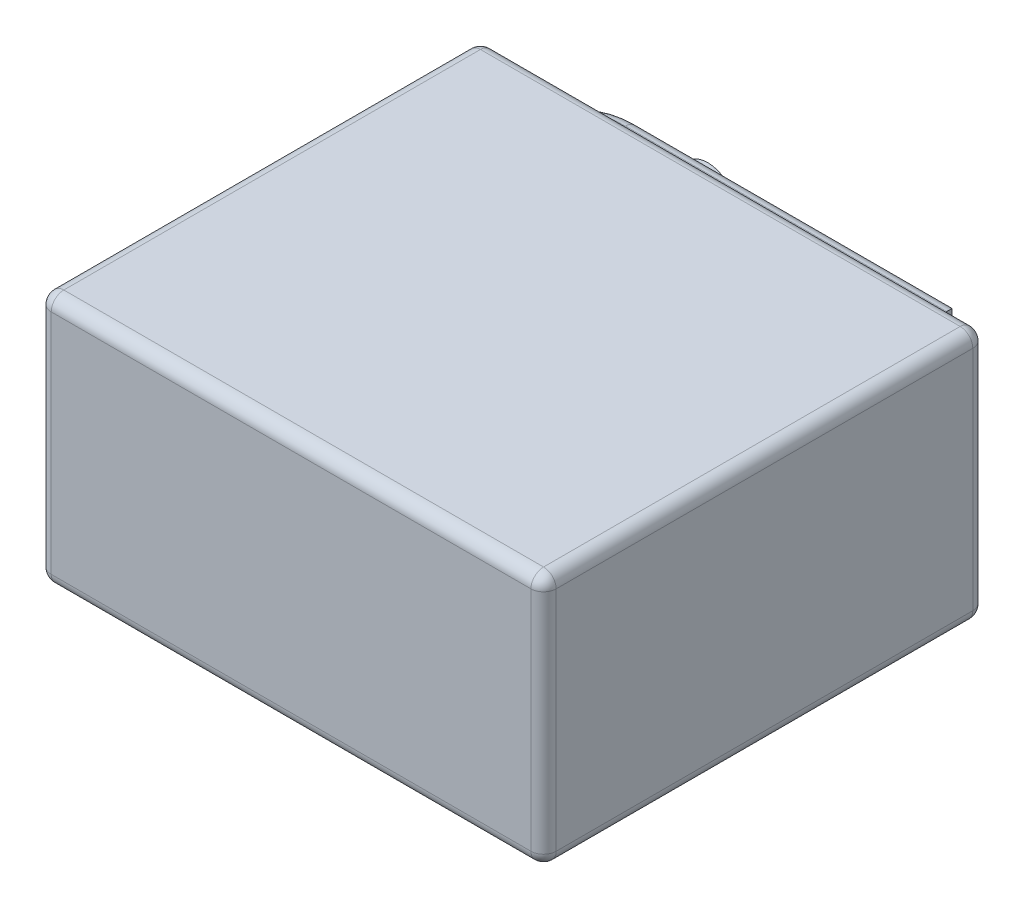
ISO-10303-21;
HEADER;
FILE_DESCRIPTION(('STEP AP214'),'2;1');
FILE_NAME('part.step','',(''),(''),'','','');
FILE_SCHEMA(('AUTOMOTIVE_DESIGN { 1 0 10303 214 1 1 1 1 }'));
ENDSEC;
DATA;
#1=APPLICATION_CONTEXT('core data for automotive mechanical design processes');
#2=APPLICATION_PROTOCOL_DEFINITION('international standard','automotive_design',2000,#1);
#3=PRODUCT_CONTEXT('',#1,'mechanical');
#4=PRODUCT('Part','Part','',(#3));
#5=PRODUCT_RELATED_PRODUCT_CATEGORY('part','',(#4));
#6=PRODUCT_DEFINITION_FORMATION('','',#4);
#7=PRODUCT_DEFINITION_CONTEXT('part definition',#1,'design');
#8=PRODUCT_DEFINITION('design','',#6,#7);
#9=PRODUCT_DEFINITION_SHAPE('','',#8);
#10=(LENGTH_UNIT() NAMED_UNIT(*) SI_UNIT(.MILLI.,.METRE.));
#11=(NAMED_UNIT(*) PLANE_ANGLE_UNIT() SI_UNIT($,.RADIAN.));
#12=(NAMED_UNIT(*) SI_UNIT($,.STERADIAN.) SOLID_ANGLE_UNIT());
#13=UNCERTAINTY_MEASURE_WITH_UNIT(LENGTH_MEASURE(1.E-05),#10,'distance_accuracy_value','');
#14=(GEOMETRIC_REPRESENTATION_CONTEXT(3) GLOBAL_UNCERTAINTY_ASSIGNED_CONTEXT((#13)) GLOBAL_UNIT_ASSIGNED_CONTEXT((#10,
#11,#12)) REPRESENTATION_CONTEXT('',''));
#15=CARTESIAN_POINT('',(0.,0.,0.));
#16=DIRECTION('',(0.,0.,1.));
#17=DIRECTION('',(1.,0.,0.));
#18=AXIS2_PLACEMENT_3D('',#15,#16,#17);
#19=CARTESIAN_POINT('',(0.,0.,0.));
#20=DIRECTION('',(0.,0.,1.));
#21=DIRECTION('',(1.,0.,0.));
#22=AXIS2_PLACEMENT_3D('',#19,#20,#21);
#23=PLANE('',#22);
#24=DIRECTION('',(-1.,0.,0.));
#25=VECTOR('',#24,1.);
#26=CARTESIAN_POINT('',(0.,9.,0.));
#27=LINE('',#26,#25);
#28=CARTESIAN_POINT('',(-19.,9.,0.));
#29=VERTEX_POINT('',#28);
#30=CARTESIAN_POINT('',(-10.,9.,0.));
#31=VERTEX_POINT('',#30);
#32=EDGE_CURVE('E263',#29,#31,#27,.F.);
#33=ORIENTED_EDGE('',*,*,#32,.T.);
#34=CARTESIAN_POINT('',(-10.,0.,0.));
#35=DIRECTION('',(0.,0.,1.));
#36=DIRECTION('',(1.,0.,0.));
#37=AXIS2_PLACEMENT_3D('',#34,#35,#36);
#38=CIRCLE('',#37,9.00000000000001);
#39=CARTESIAN_POINT('',(-19.,0.,0.));
#40=VERTEX_POINT('',#39);
#41=EDGE_CURVE('E351',#31,#40,#38,.T.);
#42=ORIENTED_EDGE('',*,*,#41,.T.);
#43=DIRECTION('',(0.,-1.,0.));
#44=VECTOR('',#43,1.);
#45=CARTESIAN_POINT('',(-19.,0.,0.));
#46=LINE('',#45,#44);
#47=EDGE_CURVE('E258',#40,#29,#46,.F.);
#48=ORIENTED_EDGE('',*,*,#47,.T.);
#49=EDGE_LOOP('',(#33,#42,#48));
#50=FACE_BOUND('',#49,.T.);
#51=ADVANCED_FACE('F37',(#50),#23,.F.);
#52=CARTESIAN_POINT('',(-19.,-9.,0.));
#53=VERTEX_POINT('',#52);
#54=EDGE_CURVE('E259',#53,#40,#46,.F.);
#55=ORIENTED_EDGE('',*,*,#54,.T.);
#56=CARTESIAN_POINT('',(-10.,0.,0.));
#57=DIRECTION('',(0.,0.,1.));
#58=DIRECTION('',(1.,0.,0.));
#59=AXIS2_PLACEMENT_3D('',#56,#57,#58);
#60=CIRCLE('',#59,9.00000000000001);
#61=CARTESIAN_POINT('',(-10.,-9.,0.));
#62=VERTEX_POINT('',#61);
#63=EDGE_CURVE('E349',#40,#62,#60,.T.);
#64=ORIENTED_EDGE('',*,*,#63,.T.);
#65=DIRECTION('',(1.,0.,0.));
#66=VECTOR('',#65,1.);
#67=CARTESIAN_POINT('',(0.,-9.,0.));
#68=LINE('',#67,#66);
#69=EDGE_CURVE('E251',#62,#53,#68,.F.);
#70=ORIENTED_EDGE('',*,*,#69,.T.);
#71=EDGE_LOOP('',(#55,#64,#70));
#72=FACE_BOUND('',#71,.T.);
#73=ADVANCED_FACE('F440',(#72),#23,.F.);
#74=CARTESIAN_POINT('',(14.4440710455683,-7.,0.));
#75=DIRECTION('',(0.,0.,1.));
#76=DIRECTION('',(1.,0.,0.));
#77=AXIS2_PLACEMENT_3D('',#74,#75,#76);
#78=CIRCLE('',#77,2.);
#79=CARTESIAN_POINT('',(16.4440710455683,-7.,0.));
#80=VERTEX_POINT('',#79);
#81=CARTESIAN_POINT('',(14.4440710455683,-9.,0.));
#82=VERTEX_POINT('',#81);
#83=EDGE_CURVE('E343',#80,#82,#78,.F.);
#84=ORIENTED_EDGE('',*,*,#83,.F.);
#85=DIRECTION('',(0.,-1.,0.));
#86=VECTOR('',#85,1.);
#87=CARTESIAN_POINT('',(16.4440710455683,8.,0.));
#88=LINE('',#87,#86);
#89=CARTESIAN_POINT('',(16.4440710455683,9.,0.));
#90=VERTEX_POINT('',#89);
#91=EDGE_CURVE('E346',#80,#90,#88,.F.);
#92=ORIENTED_EDGE('',*,*,#91,.T.);
#93=CARTESIAN_POINT('',(19.,9.,0.));
#94=VERTEX_POINT('',#93);
#95=EDGE_CURVE('E262',#90,#94,#27,.F.);
#96=ORIENTED_EDGE('',*,*,#95,.T.);
#97=DIRECTION('',(0.,1.,0.));
#98=VECTOR('',#97,1.);
#99=CARTESIAN_POINT('',(19.,0.,0.));
#100=LINE('',#99,#98);
#101=CARTESIAN_POINT('',(19.,-9.,0.));
#102=VERTEX_POINT('',#101);
#103=EDGE_CURVE('E255',#94,#102,#100,.F.);
#104=ORIENTED_EDGE('',*,*,#103,.T.);
#105=EDGE_CURVE('E252',#102,#82,#68,.F.);
#106=ORIENTED_EDGE('',*,*,#105,.T.);
#107=EDGE_LOOP('',(#84,#92,#96,#104,#106));
#108=FACE_BOUND('',#107,.T.);
#109=ADVANCED_FACE('F443',(#108),#23,.F.);
#110=CARTESIAN_POINT('',(20.,10.,35.));
#111=DIRECTION('',(-1.,0.,0.));
#112=DIRECTION('',(0.,0.,1.));
#113=AXIS2_PLACEMENT_3D('',#110,#111,#112);
#114=PLANE('',#113);
#115=DIRECTION('',(0.,0.,-1.));
#116=VECTOR('',#115,1.);
#117=CARTESIAN_POINT('',(20.,9.,35.));
#118=LINE('',#117,#116);
#119=CARTESIAN_POINT('',(20.,9.,1.));
#120=VERTEX_POINT('',#119);
#121=CARTESIAN_POINT('',(20.,9.,34.));
#122=VERTEX_POINT('',#121);
#123=EDGE_CURVE('E237',#120,#122,#118,.F.);
#124=ORIENTED_EDGE('',*,*,#123,.T.);
#125=DIRECTION('',(0.,1.,0.));
#126=VECTOR('',#125,1.);
#127=CARTESIAN_POINT('',(20.,-10.,34.));
#128=LINE('',#127,#126);
#129=CARTESIAN_POINT('',(20.,-9.,34.));
#130=VERTEX_POINT('',#129);
#131=EDGE_CURVE('E239',#122,#130,#128,.F.);
#132=ORIENTED_EDGE('',*,*,#131,.T.);
#133=DIRECTION('',(0.,0.,-1.));
#134=VECTOR('',#133,1.);
#135=CARTESIAN_POINT('',(20.,-9.,35.));
#136=LINE('',#135,#134);
#137=CARTESIAN_POINT('',(20.,-9.,1.));
#138=VERTEX_POINT('',#137);
#139=EDGE_CURVE('E233',#130,#138,#136,.T.);
#140=ORIENTED_EDGE('',*,*,#139,.T.);
#141=DIRECTION('',(0.,1.,0.));
#142=VECTOR('',#141,1.);
#143=CARTESIAN_POINT('',(20.,10.,1.));
#144=LINE('',#143,#142);
#145=EDGE_CURVE('E235',#138,#120,#144,.T.);
#146=ORIENTED_EDGE('',*,*,#145,.T.);
#147=EDGE_LOOP('',(#124,#132,#140,#146));
#148=FACE_BOUND('',#147,.T.);
#149=ADVANCED_FACE('F450',(#148),#114,.F.);
#150=CARTESIAN_POINT('',(-20.,10.,35.));
#151=DIRECTION('',(0.,-1.,0.));
#152=DIRECTION('',(0.,0.,-1.));
#153=AXIS2_PLACEMENT_3D('',#150,#151,#152);
#154=PLANE('',#153);
#155=DIRECTION('',(-1.,0.,0.));
#156=VECTOR('',#155,1.);
#157=CARTESIAN_POINT('',(20.,10.,34.));
#158=LINE('',#157,#156);
#159=CARTESIAN_POINT('',(-19.,10.,34.));
#160=VERTEX_POINT('',#159);
#161=CARTESIAN_POINT('',(19.,10.,34.));
#162=VERTEX_POINT('',#161);
#163=EDGE_CURVE('E246',#160,#162,#158,.F.);
#164=ORIENTED_EDGE('',*,*,#163,.T.);
#165=DIRECTION('',(0.,0.,-1.));
#166=VECTOR('',#165,1.);
#167=CARTESIAN_POINT('',(19.,10.,35.));
#168=LINE('',#167,#166);
#169=CARTESIAN_POINT('',(19.,10.,1.));
#170=VERTEX_POINT('',#169);
#171=EDGE_CURVE('E248',#162,#170,#168,.T.);
#172=ORIENTED_EDGE('',*,*,#171,.T.);
#173=DIRECTION('',(-1.,0.,0.));
#174=VECTOR('',#173,1.);
#175=CARTESIAN_POINT('',(-20.,10.,1.));
#176=LINE('',#175,#174);
#177=CARTESIAN_POINT('',(-19.,10.,1.));
#178=VERTEX_POINT('',#177);
#179=EDGE_CURVE('E242',#170,#178,#176,.T.);
#180=ORIENTED_EDGE('',*,*,#179,.T.);
#181=DIRECTION('',(0.,0.,-1.));
#182=VECTOR('',#181,1.);
#183=CARTESIAN_POINT('',(-19.,10.,35.));
#184=LINE('',#183,#182);
#185=EDGE_CURVE('E244',#178,#160,#184,.F.);
#186=ORIENTED_EDGE('',*,*,#185,.T.);
#187=EDGE_LOOP('',(#164,#172,#180,#186));
#188=FACE_BOUND('',#187,.T.);
#189=ADVANCED_FACE('F455',(#188),#154,.F.);
#190=CARTESIAN_POINT('',(-20.,10.,35.));
#191=DIRECTION('',(1.,0.,0.));
#192=DIRECTION('',(0.,1.,0.));
#193=AXIS2_PLACEMENT_3D('',#190,#191,#192);
#194=PLANE('',#193);
#195=DIRECTION('',(0.,0.,-1.));
#196=VECTOR('',#195,1.);
#197=CARTESIAN_POINT('',(-20.,-9.,35.));
#198=LINE('',#197,#196);
#199=CARTESIAN_POINT('',(-20.,-9.,1.));
#200=VERTEX_POINT('',#199);
#201=CARTESIAN_POINT('',(-20.,-9.,34.));
#202=VERTEX_POINT('',#201);
#203=EDGE_CURVE('E223',#200,#202,#198,.F.);
#204=ORIENTED_EDGE('',*,*,#203,.T.);
#205=DIRECTION('',(0.,-1.,0.));
#206=VECTOR('',#205,1.);
#207=CARTESIAN_POINT('',(-20.,10.,34.));
#208=LINE('',#207,#206);
#209=CARTESIAN_POINT('',(-20.,9.,34.));
#210=VERTEX_POINT('',#209);
#211=EDGE_CURVE('E192',#202,#210,#208,.F.);
#212=ORIENTED_EDGE('',*,*,#211,.T.);
#213=DIRECTION('',(0.,0.,-1.));
#214=VECTOR('',#213,1.);
#215=CARTESIAN_POINT('',(-20.,9.,35.));
#216=LINE('',#215,#214);
#217=CARTESIAN_POINT('',(-20.,9.,1.));
#218=VERTEX_POINT('',#217);
#219=EDGE_CURVE('E230',#210,#218,#216,.T.);
#220=ORIENTED_EDGE('',*,*,#219,.T.);
#221=DIRECTION('',(0.,-1.,0.));
#222=VECTOR('',#221,1.);
#223=CARTESIAN_POINT('',(-20.,10.,1.));
#224=LINE('',#223,#222);
#225=EDGE_CURVE('E228',#218,#200,#224,.T.);
#226=ORIENTED_EDGE('',*,*,#225,.T.);
#227=EDGE_LOOP('',(#204,#212,#220,#226));
#228=FACE_BOUND('',#227,.T.);
#229=ADVANCED_FACE('F528',(#228),#194,.F.);
#230=CARTESIAN_POINT('',(-20.,-10.,35.));
#231=DIRECTION('',(0.,1.,0.));
#232=DIRECTION('',(0.,0.,1.));
#233=AXIS2_PLACEMENT_3D('',#230,#231,#232);
#234=PLANE('',#233);
#235=DIRECTION('',(1.,0.,0.));
#236=VECTOR('',#235,1.);
#237=CARTESIAN_POINT('',(-20.,-10.,34.));
#238=LINE('',#237,#236);
#239=CARTESIAN_POINT('',(19.,-10.,34.));
#240=VERTEX_POINT('',#239);
#241=CARTESIAN_POINT('',(-19.,-10.,34.));
#242=VERTEX_POINT('',#241);
#243=EDGE_CURVE('E271',#240,#242,#238,.F.);
#244=ORIENTED_EDGE('',*,*,#243,.T.);
#245=DIRECTION('',(0.,0.,-1.));
#246=VECTOR('',#245,1.);
#247=CARTESIAN_POINT('',(-19.,-10.,35.));
#248=LINE('',#247,#246);
#249=CARTESIAN_POINT('',(-19.,-10.,1.));
#250=VERTEX_POINT('',#249);
#251=EDGE_CURVE('E273',#242,#250,#248,.T.);
#252=ORIENTED_EDGE('',*,*,#251,.T.);
#253=DIRECTION('',(1.,0.,0.));
#254=VECTOR('',#253,1.);
#255=CARTESIAN_POINT('',(-20.,-10.,1.));
#256=LINE('',#255,#254);
#257=CARTESIAN_POINT('',(19.,-10.,1.));
#258=VERTEX_POINT('',#257);
#259=EDGE_CURVE('E266',#250,#258,#256,.T.);
#260=ORIENTED_EDGE('',*,*,#259,.T.);
#261=DIRECTION('',(0.,0.,-1.));
#262=VECTOR('',#261,1.);
#263=CARTESIAN_POINT('',(19.,-10.,35.));
#264=LINE('',#263,#262);
#265=EDGE_CURVE('E269',#258,#240,#264,.F.);
#266=ORIENTED_EDGE('',*,*,#265,.T.);
#267=EDGE_LOOP('',(#244,#252,#260,#266));
#268=FACE_BOUND('',#267,.T.);
#269=ADVANCED_FACE('F560',(#268),#234,.F.);
#270=CARTESIAN_POINT('',(0.,0.,35.));
#271=DIRECTION('',(0.,0.,1.));
#272=DIRECTION('',(1.,0.,0.));
#273=AXIS2_PLACEMENT_3D('',#270,#271,#272);
#274=PLANE('',#273);
#275=DIRECTION('',(0.,1.,0.));
#276=VECTOR('',#275,1.);
#277=CARTESIAN_POINT('',(19.,10.,35.));
#278=LINE('',#277,#276);
#279=CARTESIAN_POINT('',(19.,-9.,35.));
#280=VERTEX_POINT('',#279);
#281=CARTESIAN_POINT('',(19.,9.,35.));
#282=VERTEX_POINT('',#281);
#283=EDGE_CURVE('E215',#280,#282,#278,.T.);
#284=ORIENTED_EDGE('',*,*,#283,.T.);
#285=DIRECTION('',(-1.,0.,0.));
#286=VECTOR('',#285,1.);
#287=CARTESIAN_POINT('',(-20.,9.,35.));
#288=LINE('',#287,#286);
#289=CARTESIAN_POINT('',(-19.,9.,35.));
#290=VERTEX_POINT('',#289);
#291=EDGE_CURVE('E220',#282,#290,#288,.T.);
#292=ORIENTED_EDGE('',*,*,#291,.T.);
#293=DIRECTION('',(0.,-1.,0.));
#294=VECTOR('',#293,1.);
#295=CARTESIAN_POINT('',(-19.,-10.,35.));
#296=LINE('',#295,#294);
#297=CARTESIAN_POINT('',(-19.,-9.,35.));
#298=VERTEX_POINT('',#297);
#299=EDGE_CURVE('E190',#290,#298,#296,.T.);
#300=ORIENTED_EDGE('',*,*,#299,.T.);
#301=DIRECTION('',(1.,0.,0.));
#302=VECTOR('',#301,1.);
#303=CARTESIAN_POINT('',(20.,-9.,35.));
#304=LINE('',#303,#302);
#305=EDGE_CURVE('E209',#298,#280,#304,.T.);
#306=ORIENTED_EDGE('',*,*,#305,.T.);
#307=EDGE_LOOP('',(#284,#292,#300,#306));
#308=FACE_BOUND('',#307,.T.);
#309=ADVANCED_FACE('F218',(#308),#274,.T.);
#310=CARTESIAN_POINT('',(19.,10.,1.));
#311=DIRECTION('',(0.,1.,0.));
#312=DIRECTION('',(0.,0.,1.));
#313=AXIS2_PLACEMENT_3D('',#310,#311,#312);
#314=CYLINDRICAL_SURFACE('',#313,1.);
#315=CARTESIAN_POINT('',(19.,9.,1.));
#316=DIRECTION('',(0.,1.,0.));
#317=DIRECTION('',(0.,0.,1.));
#318=AXIS2_PLACEMENT_3D('',#315,#316,#317);
#319=CIRCLE('',#318,1.);
#320=EDGE_CURVE('E216',#120,#94,#319,.T.);
#321=ORIENTED_EDGE('',*,*,#320,.F.);
#322=ORIENTED_EDGE('',*,*,#145,.F.);
#323=CARTESIAN_POINT('',(19.,-9.,1.));
#324=DIRECTION('',(0.,-1.,0.));
#325=DIRECTION('',(1.,0.,0.));
#326=AXIS2_PLACEMENT_3D('',#323,#324,#325);
#327=CIRCLE('',#326,1.);
#328=EDGE_CURVE('E328',#102,#138,#327,.T.);
#329=ORIENTED_EDGE('',*,*,#328,.F.);
#330=ORIENTED_EDGE('',*,*,#103,.F.);
#331=EDGE_LOOP('',(#321,#322,#329,#330));
#332=FACE_BOUND('',#331,.T.);
#333=ADVANCED_FACE('F498',(#332),#314,.T.);
#334=CARTESIAN_POINT('',(19.,9.,1.));
#335=DIRECTION('',(0.,0.,1.));
#336=DIRECTION('',(1.,0.,0.));
#337=AXIS2_PLACEMENT_3D('',#334,#335,#336);
#338=SPHERICAL_SURFACE('',#337,1.);
#339=CARTESIAN_POINT('',(19.,9.,1.));
#340=DIRECTION('',(0.,0.,-1.));
#341=DIRECTION('',(-1.,0.,0.));
#342=AXIS2_PLACEMENT_3D('',#339,#340,#341);
#343=CIRCLE('',#342,1.);
#344=EDGE_CURVE('E322',#120,#170,#343,.F.);
#345=ORIENTED_EDGE('',*,*,#344,.F.);
#346=ORIENTED_EDGE('',*,*,#320,.T.);
#347=CARTESIAN_POINT('',(19.,9.,1.));
#348=DIRECTION('',(1.,0.,0.));
#349=DIRECTION('',(0.,0.,-1.));
#350=AXIS2_PLACEMENT_3D('',#347,#348,#349);
#351=CIRCLE('',#350,1.);
#352=EDGE_CURVE('E325',#170,#94,#351,.F.);
#353=ORIENTED_EDGE('',*,*,#352,.F.);
#354=EDGE_LOOP('',(#345,#346,#353));
#355=FACE_BOUND('',#354,.T.);
#356=ADVANCED_FACE('F494',(#355),#338,.T.);
#357=CARTESIAN_POINT('',(19.,-9.,1.));
#358=DIRECTION('',(0.,0.,1.));
#359=DIRECTION('',(1.,0.,0.));
#360=AXIS2_PLACEMENT_3D('',#357,#358,#359);
#361=SPHERICAL_SURFACE('',#360,1.);
#362=CARTESIAN_POINT('',(19.,-9.,1.));
#363=DIRECTION('',(1.,0.,0.));
#364=DIRECTION('',(0.,0.,-1.));
#365=AXIS2_PLACEMENT_3D('',#362,#363,#364);
#366=CIRCLE('',#365,1.);
#367=EDGE_CURVE('E316',#102,#258,#366,.F.);
#368=ORIENTED_EDGE('',*,*,#367,.F.);
#369=ORIENTED_EDGE('',*,*,#328,.T.);
#370=CARTESIAN_POINT('',(19.,-9.,1.));
#371=DIRECTION('',(0.,0.,-1.));
#372=DIRECTION('',(-1.,0.,0.));
#373=AXIS2_PLACEMENT_3D('',#370,#371,#372);
#374=CIRCLE('',#373,1.);
#375=EDGE_CURVE('E319',#258,#138,#374,.F.);
#376=ORIENTED_EDGE('',*,*,#375,.F.);
#377=EDGE_LOOP('',(#368,#369,#376));
#378=FACE_BOUND('',#377,.T.);
#379=ADVANCED_FACE('F502',(#378),#361,.T.);
#380=CARTESIAN_POINT('',(-20.,9.,1.));
#381=DIRECTION('',(-1.,0.,0.));
#382=DIRECTION('',(0.,0.,1.));
#383=AXIS2_PLACEMENT_3D('',#380,#381,#382);
#384=CYLINDRICAL_SURFACE('',#383,1.);
#385=ORIENTED_EDGE('',*,*,#352,.T.);
#386=ORIENTED_EDGE('',*,*,#95,.F.);
#387=EDGE_CURVE('E267',#31,#90,#27,.F.);
#388=ORIENTED_EDGE('',*,*,#387,.F.);
#389=ORIENTED_EDGE('',*,*,#32,.F.);
#390=CARTESIAN_POINT('',(-19.,9.,1.));
#391=DIRECTION('',(-1.,0.,0.));
#392=DIRECTION('',(0.,0.,1.));
#393=AXIS2_PLACEMENT_3D('',#390,#391,#392);
#394=CIRCLE('',#393,1.);
#395=EDGE_CURVE('E310',#178,#29,#394,.T.);
#396=ORIENTED_EDGE('',*,*,#395,.F.);
#397=ORIENTED_EDGE('',*,*,#179,.F.);
#398=EDGE_LOOP('',(#385,#386,#388,#389,#396,#397));
#399=FACE_BOUND('',#398,.T.);
#400=ADVANCED_FACE('F489',(#399),#384,.T.);
#401=CARTESIAN_POINT('',(19.,9.,35.));
#402=DIRECTION('',(0.,0.,-1.));
#403=DIRECTION('',(-1.,0.,0.));
#404=AXIS2_PLACEMENT_3D('',#401,#402,#403);
#405=CYLINDRICAL_SURFACE('',#404,1.);
#406=ORIENTED_EDGE('',*,*,#344,.T.);
#407=ORIENTED_EDGE('',*,*,#171,.F.);
#408=CARTESIAN_POINT('',(19.,9.,34.));
#409=DIRECTION('',(0.,0.,1.));
#410=DIRECTION('',(1.,0.,0.));
#411=AXIS2_PLACEMENT_3D('',#408,#409,#410);
#412=CIRCLE('',#411,1.);
#413=EDGE_CURVE('E307',#122,#162,#412,.T.);
#414=ORIENTED_EDGE('',*,*,#413,.F.);
#415=ORIENTED_EDGE('',*,*,#123,.F.);
#416=EDGE_LOOP('',(#406,#407,#414,#415));
#417=FACE_BOUND('',#416,.T.);
#418=ADVANCED_FACE('F549',(#417),#405,.T.);
#419=CARTESIAN_POINT('',(19.,0.,34.));
#420=DIRECTION('',(0.,-1.,0.));
#421=DIRECTION('',(0.,0.,-1.));
#422=AXIS2_PLACEMENT_3D('',#419,#420,#421);
#423=CYLINDRICAL_SURFACE('',#422,1.);
#424=CARTESIAN_POINT('',(19.,-9.,34.));
#425=DIRECTION('',(0.,-1.,0.));
#426=DIRECTION('',(0.,0.,-1.));
#427=AXIS2_PLACEMENT_3D('',#424,#425,#426);
#428=CIRCLE('',#427,1.);
#429=EDGE_CURVE('E301',#130,#280,#428,.T.);
#430=ORIENTED_EDGE('',*,*,#429,.F.);
#431=ORIENTED_EDGE('',*,*,#131,.F.);
#432=CARTESIAN_POINT('',(19.,9.,34.));
#433=DIRECTION('',(0.,1.,0.));
#434=DIRECTION('',(0.,0.,1.));
#435=AXIS2_PLACEMENT_3D('',#432,#433,#434);
#436=CIRCLE('',#435,1.);
#437=EDGE_CURVE('E304',#282,#122,#436,.T.);
#438=ORIENTED_EDGE('',*,*,#437,.F.);
#439=ORIENTED_EDGE('',*,*,#283,.F.);
#440=EDGE_LOOP('',(#430,#431,#438,#439));
#441=FACE_BOUND('',#440,.T.);
#442=ADVANCED_FACE('F553',(#441),#423,.T.);
#443=CARTESIAN_POINT('',(19.,-9.,35.));
#444=DIRECTION('',(0.,0.,-1.));
#445=DIRECTION('',(-1.,0.,0.));
#446=AXIS2_PLACEMENT_3D('',#443,#444,#445);
#447=CYLINDRICAL_SURFACE('',#446,1.);
#448=ORIENTED_EDGE('',*,*,#375,.T.);
#449=ORIENTED_EDGE('',*,*,#139,.F.);
#450=CARTESIAN_POINT('',(19.,-9.,34.));
#451=DIRECTION('',(0.,0.,1.));
#452=DIRECTION('',(1.,0.,0.));
#453=AXIS2_PLACEMENT_3D('',#450,#451,#452);
#454=CIRCLE('',#453,1.);
#455=EDGE_CURVE('E299',#240,#130,#454,.T.);
#456=ORIENTED_EDGE('',*,*,#455,.F.);
#457=ORIENTED_EDGE('',*,*,#265,.F.);
#458=EDGE_LOOP('',(#448,#449,#456,#457));
#459=FACE_BOUND('',#458,.T.);
#460=ADVANCED_FACE('F558',(#459),#447,.T.);
#461=CARTESIAN_POINT('',(-20.,-9.,1.));
#462=DIRECTION('',(1.,0.,0.));
#463=DIRECTION('',(0.,0.,-1.));
#464=AXIS2_PLACEMENT_3D('',#461,#462,#463);
#465=CYLINDRICAL_SURFACE('',#464,1.);
#466=ORIENTED_EDGE('',*,*,#367,.T.);
#467=ORIENTED_EDGE('',*,*,#259,.F.);
#468=CARTESIAN_POINT('',(-19.,-9.,1.));
#469=DIRECTION('',(-1.,0.,0.));
#470=DIRECTION('',(0.,0.,1.));
#471=AXIS2_PLACEMENT_3D('',#468,#469,#470);
#472=CIRCLE('',#471,1.);
#473=EDGE_CURVE('E296',#53,#250,#472,.T.);
#474=ORIENTED_EDGE('',*,*,#473,.F.);
#475=ORIENTED_EDGE('',*,*,#69,.F.);
#476=EDGE_CURVE('E256',#82,#62,#68,.F.);
#477=ORIENTED_EDGE('',*,*,#476,.F.);
#478=ORIENTED_EDGE('',*,*,#105,.F.);
#479=EDGE_LOOP('',(#466,#467,#474,#475,#477,#478));
#480=FACE_BOUND('',#479,.T.);
#481=ADVANCED_FACE('F506',(#480),#465,.T.);
#482=CARTESIAN_POINT('',(-19.,10.,1.));
#483=DIRECTION('',(0.,-1.,0.));
#484=DIRECTION('',(1.,0.,0.));
#485=AXIS2_PLACEMENT_3D('',#482,#483,#484);
#486=CYLINDRICAL_SURFACE('',#485,1.);
#487=CARTESIAN_POINT('',(-19.,9.,1.));
#488=DIRECTION('',(0.,1.,0.));
#489=DIRECTION('',(0.,0.,1.));
#490=AXIS2_PLACEMENT_3D('',#487,#488,#489);
#491=CIRCLE('',#490,1.);
#492=EDGE_CURVE('E313',#29,#218,#491,.T.);
#493=ORIENTED_EDGE('',*,*,#492,.F.);
#494=ORIENTED_EDGE('',*,*,#47,.F.);
#495=ORIENTED_EDGE('',*,*,#54,.F.);
#496=CARTESIAN_POINT('',(-19.,-9.,1.));
#497=DIRECTION('',(0.,-1.,0.));
#498=DIRECTION('',(0.,0.,-1.));
#499=AXIS2_PLACEMENT_3D('',#496,#497,#498);
#500=CIRCLE('',#499,1.);
#501=EDGE_CURVE('E293',#200,#53,#500,.T.);
#502=ORIENTED_EDGE('',*,*,#501,.F.);
#503=ORIENTED_EDGE('',*,*,#225,.F.);
#504=EDGE_LOOP('',(#493,#494,#495,#502,#503));
#505=FACE_BOUND('',#504,.T.);
#506=ADVANCED_FACE('F518',(#505),#486,.T.);
#507=CARTESIAN_POINT('',(-19.,9.,1.));
#508=DIRECTION('',(0.,0.,1.));
#509=DIRECTION('',(1.,0.,0.));
#510=AXIS2_PLACEMENT_3D('',#507,#508,#509);
#511=SPHERICAL_SURFACE('',#510,1.);
#512=ORIENTED_EDGE('',*,*,#395,.T.);
#513=ORIENTED_EDGE('',*,*,#492,.T.);
#514=CARTESIAN_POINT('',(-19.,9.,1.));
#515=DIRECTION('',(0.,0.,-1.));
#516=DIRECTION('',(-1.,0.,0.));
#517=AXIS2_PLACEMENT_3D('',#514,#515,#516);
#518=CIRCLE('',#517,1.);
#519=EDGE_CURVE('E290',#178,#218,#518,.F.);
#520=ORIENTED_EDGE('',*,*,#519,.F.);
#521=EDGE_LOOP('',(#512,#513,#520));
#522=FACE_BOUND('',#521,.T.);
#523=ADVANCED_FACE('F532',(#522),#511,.T.);
#524=CARTESIAN_POINT('',(19.,9.,34.));
#525=DIRECTION('',(0.,0.,1.));
#526=DIRECTION('',(1.,0.,0.));
#527=AXIS2_PLACEMENT_3D('',#524,#525,#526);
#528=SPHERICAL_SURFACE('',#527,1.);
#529=ORIENTED_EDGE('',*,*,#437,.T.);
#530=ORIENTED_EDGE('',*,*,#413,.T.);
#531=CARTESIAN_POINT('',(19.,9.,34.));
#532=DIRECTION('',(1.,0.,0.));
#533=DIRECTION('',(0.,0.,-1.));
#534=AXIS2_PLACEMENT_3D('',#531,#532,#533);
#535=CIRCLE('',#534,1.);
#536=EDGE_CURVE('E287',#282,#162,#535,.F.);
#537=ORIENTED_EDGE('',*,*,#536,.F.);
#538=EDGE_LOOP('',(#529,#530,#537));
#539=FACE_BOUND('',#538,.T.);
#540=ADVANCED_FACE('F545',(#539),#528,.T.);
#541=CARTESIAN_POINT('',(19.,-9.,34.));
#542=DIRECTION('',(0.,0.,1.));
#543=DIRECTION('',(1.,0.,0.));
#544=AXIS2_PLACEMENT_3D('',#541,#542,#543);
#545=SPHERICAL_SURFACE('',#544,1.);
#546=ORIENTED_EDGE('',*,*,#455,.T.);
#547=ORIENTED_EDGE('',*,*,#429,.T.);
#548=CARTESIAN_POINT('',(19.,-9.,34.));
#549=DIRECTION('',(1.,0.,0.));
#550=DIRECTION('',(0.,0.,-1.));
#551=AXIS2_PLACEMENT_3D('',#548,#549,#550);
#552=CIRCLE('',#551,1.);
#553=EDGE_CURVE('E212',#240,#280,#552,.F.);
#554=ORIENTED_EDGE('',*,*,#553,.F.);
#555=EDGE_LOOP('',(#546,#547,#554));
#556=FACE_BOUND('',#555,.T.);
#557=ADVANCED_FACE('F589',(#556),#545,.T.);
#558=CARTESIAN_POINT('',(-19.,-9.,1.));
#559=DIRECTION('',(0.,0.,1.));
#560=DIRECTION('',(1.,0.,0.));
#561=AXIS2_PLACEMENT_3D('',#558,#559,#560);
#562=SPHERICAL_SURFACE('',#561,1.);
#563=ORIENTED_EDGE('',*,*,#501,.T.);
#564=ORIENTED_EDGE('',*,*,#473,.T.);
#565=CARTESIAN_POINT('',(-19.,-9.,1.));
#566=DIRECTION('',(0.,0.,-1.));
#567=DIRECTION('',(-1.,0.,0.));
#568=AXIS2_PLACEMENT_3D('',#565,#566,#567);
#569=CIRCLE('',#568,1.);
#570=EDGE_CURVE('E284',#200,#250,#569,.F.);
#571=ORIENTED_EDGE('',*,*,#570,.F.);
#572=EDGE_LOOP('',(#563,#564,#571));
#573=FACE_BOUND('',#572,.T.);
#574=ADVANCED_FACE('F522',(#573),#562,.T.);
#575=CARTESIAN_POINT('',(-19.,9.,35.));
#576=DIRECTION('',(0.,0.,-1.));
#577=DIRECTION('',(-1.,0.,0.));
#578=AXIS2_PLACEMENT_3D('',#575,#576,#577);
#579=CYLINDRICAL_SURFACE('',#578,1.);
#580=ORIENTED_EDGE('',*,*,#519,.T.);
#581=ORIENTED_EDGE('',*,*,#219,.F.);
#582=CARTESIAN_POINT('',(-19.,9.,34.));
#583=DIRECTION('',(0.,0.,1.));
#584=DIRECTION('',(1.,0.,0.));
#585=AXIS2_PLACEMENT_3D('',#582,#583,#584);
#586=CIRCLE('',#585,1.);
#587=EDGE_CURVE('E281',#160,#210,#586,.T.);
#588=ORIENTED_EDGE('',*,*,#587,.F.);
#589=ORIENTED_EDGE('',*,*,#185,.F.);
#590=EDGE_LOOP('',(#580,#581,#588,#589));
#591=FACE_BOUND('',#590,.T.);
#592=ADVANCED_FACE('F535',(#591),#579,.T.);
#593=CARTESIAN_POINT('',(0.,9.,34.));
#594=DIRECTION('',(1.,0.,0.));
#595=DIRECTION('',(0.,0.,-1.));
#596=AXIS2_PLACEMENT_3D('',#593,#594,#595);
#597=CYLINDRICAL_SURFACE('',#596,1.);
#598=ORIENTED_EDGE('',*,*,#536,.T.);
#599=ORIENTED_EDGE('',*,*,#163,.F.);
#600=CARTESIAN_POINT('',(-19.,9.,34.));
#601=DIRECTION('',(-1.,0.,0.));
#602=DIRECTION('',(0.,0.,1.));
#603=AXIS2_PLACEMENT_3D('',#600,#601,#602);
#604=CIRCLE('',#603,1.);
#605=EDGE_CURVE('E206',#290,#160,#604,.T.);
#606=ORIENTED_EDGE('',*,*,#605,.F.);
#607=ORIENTED_EDGE('',*,*,#291,.F.);
#608=EDGE_LOOP('',(#598,#599,#606,#607));
#609=FACE_BOUND('',#608,.T.);
#610=ADVANCED_FACE('F541',(#609),#597,.T.);
#611=CARTESIAN_POINT('',(0.,-9.,34.));
#612=DIRECTION('',(-1.,0.,0.));
#613=DIRECTION('',(0.,0.,1.));
#614=AXIS2_PLACEMENT_3D('',#611,#612,#613);
#615=CYLINDRICAL_SURFACE('',#614,1.);
#616=ORIENTED_EDGE('',*,*,#553,.T.);
#617=ORIENTED_EDGE('',*,*,#305,.F.);
#618=CARTESIAN_POINT('',(-19.,-9.,34.));
#619=DIRECTION('',(-1.,0.,0.));
#620=DIRECTION('',(0.,0.,1.));
#621=AXIS2_PLACEMENT_3D('',#618,#619,#620);
#622=CIRCLE('',#621,1.);
#623=EDGE_CURVE('E199',#242,#298,#622,.T.);
#624=ORIENTED_EDGE('',*,*,#623,.F.);
#625=ORIENTED_EDGE('',*,*,#243,.F.);
#626=EDGE_LOOP('',(#616,#617,#624,#625));
#627=FACE_BOUND('',#626,.T.);
#628=ADVANCED_FACE('F210',(#627),#615,.T.);
#629=CARTESIAN_POINT('',(-19.,-9.,35.));
#630=DIRECTION('',(0.,0.,-1.));
#631=DIRECTION('',(-1.,0.,0.));
#632=AXIS2_PLACEMENT_3D('',#629,#630,#631);
#633=CYLINDRICAL_SURFACE('',#632,1.);
#634=ORIENTED_EDGE('',*,*,#570,.T.);
#635=ORIENTED_EDGE('',*,*,#251,.F.);
#636=CARTESIAN_POINT('',(-19.,-9.,34.));
#637=DIRECTION('',(0.,0.,1.));
#638=DIRECTION('',(1.,0.,0.));
#639=AXIS2_PLACEMENT_3D('',#636,#637,#638);
#640=CIRCLE('',#639,1.);
#641=EDGE_CURVE('E203',#202,#242,#640,.T.);
#642=ORIENTED_EDGE('',*,*,#641,.F.);
#643=ORIENTED_EDGE('',*,*,#203,.F.);
#644=EDGE_LOOP('',(#634,#635,#642,#643));
#645=FACE_BOUND('',#644,.T.);
#646=ADVANCED_FACE('F526',(#645),#633,.T.);
#647=CARTESIAN_POINT('',(-19.,9.,34.));
#648=DIRECTION('',(0.,0.,1.));
#649=DIRECTION('',(1.,0.,0.));
#650=AXIS2_PLACEMENT_3D('',#647,#648,#649);
#651=SPHERICAL_SURFACE('',#650,1.);
#652=ORIENTED_EDGE('',*,*,#605,.T.);
#653=ORIENTED_EDGE('',*,*,#587,.T.);
#654=CARTESIAN_POINT('',(-19.,9.,34.));
#655=DIRECTION('',(0.,1.,0.));
#656=DIRECTION('',(0.,0.,1.));
#657=AXIS2_PLACEMENT_3D('',#654,#655,#656);
#658=CIRCLE('',#657,1.);
#659=EDGE_CURVE('E195',#290,#210,#658,.F.);
#660=ORIENTED_EDGE('',*,*,#659,.F.);
#661=EDGE_LOOP('',(#652,#653,#660));
#662=FACE_BOUND('',#661,.T.);
#663=ADVANCED_FACE('F575',(#662),#651,.T.);
#664=CARTESIAN_POINT('',(-19.,-9.,34.));
#665=DIRECTION('',(0.,0.,1.));
#666=DIRECTION('',(1.,0.,0.));
#667=AXIS2_PLACEMENT_3D('',#664,#665,#666);
#668=SPHERICAL_SURFACE('',#667,1.);
#669=ORIENTED_EDGE('',*,*,#641,.T.);
#670=ORIENTED_EDGE('',*,*,#623,.T.);
#671=CARTESIAN_POINT('',(-19.,-9.,34.));
#672=DIRECTION('',(0.,-1.,0.));
#673=DIRECTION('',(0.,0.,-1.));
#674=AXIS2_PLACEMENT_3D('',#671,#672,#673);
#675=CIRCLE('',#674,1.);
#676=EDGE_CURVE('E186',#202,#298,#675,.F.);
#677=ORIENTED_EDGE('',*,*,#676,.F.);
#678=EDGE_LOOP('',(#669,#670,#677));
#679=FACE_BOUND('',#678,.T.);
#680=ADVANCED_FACE('F201',(#679),#668,.T.);
#681=CARTESIAN_POINT('',(-19.,0.,34.));
#682=DIRECTION('',(0.,1.,0.));
#683=DIRECTION('',(-1.,0.,0.));
#684=AXIS2_PLACEMENT_3D('',#681,#682,#683);
#685=CYLINDRICAL_SURFACE('',#684,1.);
#686=ORIENTED_EDGE('',*,*,#659,.T.);
#687=ORIENTED_EDGE('',*,*,#211,.F.);
#688=ORIENTED_EDGE('',*,*,#676,.T.);
#689=ORIENTED_EDGE('',*,*,#299,.F.);
#690=EDGE_LOOP('',(#686,#687,#688,#689));
#691=FACE_BOUND('',#690,.T.);
#692=ADVANCED_FACE('F188',(#691),#685,.T.);
#693=CARTESIAN_POINT('',(-10.,0.,-2.5));
#694=DIRECTION('',(0.,0.,1.));
#695=DIRECTION('',(1.,0.,0.));
#696=AXIS2_PLACEMENT_3D('',#693,#694,#695);
#697=CYLINDRICAL_SURFACE('',#696,8.);
#698=DIRECTION('',(0.,0.,1.));
#699=VECTOR('',#698,1.);
#700=CARTESIAN_POINT('',(-10.,8.,-2.5));
#701=LINE('',#700,#699);
#702=CARTESIAN_POINT('',(-10.,8.,-1.5));
#703=VERTEX_POINT('',#702);
#704=CARTESIAN_POINT('',(-10.,8.,-1.));
#705=VERTEX_POINT('',#704);
#706=EDGE_CURVE('E336',#703,#705,#701,.T.);
#707=ORIENTED_EDGE('',*,*,#706,.F.);
#708=CARTESIAN_POINT('',(-10.,0.,-1.5));
#709=DIRECTION('',(0.,0.,-1.));
#710=DIRECTION('',(-1.,0.,0.));
#711=AXIS2_PLACEMENT_3D('',#708,#709,#710);
#712=CIRCLE('',#711,8.);
#713=CARTESIAN_POINT('',(-10.,-8.,-1.5));
#714=VERTEX_POINT('',#713);
#715=EDGE_CURVE('E368',#703,#714,#712,.F.);
#716=ORIENTED_EDGE('',*,*,#715,.T.);
#717=DIRECTION('',(0.,0.,1.));
#718=VECTOR('',#717,1.);
#719=CARTESIAN_POINT('',(-10.,-8.,-2.5));
#720=LINE('',#719,#718);
#721=CARTESIAN_POINT('',(-10.,-8.,-1.));
#722=VERTEX_POINT('',#721);
#723=EDGE_CURVE('E406',#714,#722,#720,.T.);
#724=ORIENTED_EDGE('',*,*,#723,.T.);
#725=CARTESIAN_POINT('',(-10.,0.,-1.));
#726=DIRECTION('',(0.,0.,1.));
#727=DIRECTION('',(1.,0.,0.));
#728=AXIS2_PLACEMENT_3D('',#725,#726,#727);
#729=CIRCLE('',#728,8.);
#730=EDGE_CURVE('E366',#722,#705,#729,.F.);
#731=ORIENTED_EDGE('',*,*,#730,.T.);
#732=EDGE_LOOP('',(#707,#716,#724,#731));
#733=FACE_BOUND('',#732,.T.);
#734=ADVANCED_FACE('F572',(#733),#697,.T.);
#735=CARTESIAN_POINT('',(-10.,8.,-2.5));
#736=DIRECTION('',(0.,-1.,0.));
#737=DIRECTION('',(0.,0.,-1.));
#738=AXIS2_PLACEMENT_3D('',#735,#736,#737);
#739=PLANE('',#738);
#740=DIRECTION('',(0.,0.,1.));
#741=VECTOR('',#740,1.);
#742=CARTESIAN_POINT('',(15.4440710455683,8.,-2.5));
#743=LINE('',#742,#741);
#744=CARTESIAN_POINT('',(15.4440710455683,8.,-1.5));
#745=VERTEX_POINT('',#744);
#746=CARTESIAN_POINT('',(15.4440710455683,8.,-1.));
#747=VERTEX_POINT('',#746);
#748=EDGE_CURVE('E412',#745,#747,#743,.T.);
#749=ORIENTED_EDGE('',*,*,#748,.F.);
#750=DIRECTION('',(1.,0.,0.));
#751=VECTOR('',#750,1.);
#752=CARTESIAN_POINT('',(-10.,8.,-1.5));
#753=LINE('',#752,#751);
#754=EDGE_CURVE('E364',#745,#703,#753,.F.);
#755=ORIENTED_EDGE('',*,*,#754,.T.);
#756=ORIENTED_EDGE('',*,*,#706,.T.);
#757=DIRECTION('',(1.,0.,0.));
#758=VECTOR('',#757,1.);
#759=CARTESIAN_POINT('',(15.4440710455683,8.,-1.));
#760=LINE('',#759,#758);
#761=EDGE_CURVE('E362',#705,#747,#760,.T.);
#762=ORIENTED_EDGE('',*,*,#761,.T.);
#763=EDGE_LOOP('',(#749,#755,#756,#762));
#764=FACE_BOUND('',#763,.T.);
#765=ADVANCED_FACE('F741',(#764),#739,.F.);
#766=CARTESIAN_POINT('',(15.4440710455683,8.,-2.5));
#767=DIRECTION('',(-1.,0.,0.));
#768=DIRECTION('',(0.,0.,1.));
#769=AXIS2_PLACEMENT_3D('',#766,#767,#768);
#770=PLANE('',#769);
#771=ORIENTED_EDGE('',*,*,#748,.T.);
#772=DIRECTION('',(0.,-1.,0.));
#773=VECTOR('',#772,1.);
#774=CARTESIAN_POINT('',(15.4440710455683,-8.,-1.));
#775=LINE('',#774,#773);
#776=CARTESIAN_POINT('',(15.4440710455683,-7.,-1.));
#777=VERTEX_POINT('',#776);
#778=EDGE_CURVE('E340',#747,#777,#775,.T.);
#779=ORIENTED_EDGE('',*,*,#778,.T.);
#780=DIRECTION('',(0.,0.,1.));
#781=VECTOR('',#780,1.);
#782=CARTESIAN_POINT('',(15.4440710455683,-7.,-2.5));
#783=LINE('',#782,#781);
#784=CARTESIAN_POINT('',(15.4440710455683,-7.,-1.5));
#785=VERTEX_POINT('',#784);
#786=EDGE_CURVE('E338',#777,#785,#783,.F.);
#787=ORIENTED_EDGE('',*,*,#786,.T.);
#788=DIRECTION('',(0.,-1.,0.));
#789=VECTOR('',#788,1.);
#790=CARTESIAN_POINT('',(15.4440710455683,8.,-1.5));
#791=LINE('',#790,#789);
#792=EDGE_CURVE('E275',#785,#745,#791,.F.);
#793=ORIENTED_EDGE('',*,*,#792,.T.);
#794=EDGE_LOOP('',(#771,#779,#787,#793));
#795=FACE_BOUND('',#794,.T.);
#796=ADVANCED_FACE('F476',(#795),#770,.F.);
#797=CARTESIAN_POINT('',(-10.,-8.,-2.5));
#798=DIRECTION('',(0.,1.,0.));
#799=DIRECTION('',(0.,0.,1.));
#800=AXIS2_PLACEMENT_3D('',#797,#798,#799);
#801=PLANE('',#800);
#802=ORIENTED_EDGE('',*,*,#723,.F.);
#803=DIRECTION('',(-1.,0.,0.));
#804=VECTOR('',#803,1.);
#805=CARTESIAN_POINT('',(15.4440710455683,-8.,-1.5));
#806=LINE('',#805,#804);
#807=CARTESIAN_POINT('',(14.4440710455683,-8.,-1.5));
#808=VERTEX_POINT('',#807);
#809=EDGE_CURVE('E11',#714,#808,#806,.F.);
#810=ORIENTED_EDGE('',*,*,#809,.T.);
#811=DIRECTION('',(0.,0.,1.));
#812=VECTOR('',#811,1.);
#813=CARTESIAN_POINT('',(14.4440710455683,-8.,-2.5));
#814=LINE('',#813,#812);
#815=CARTESIAN_POINT('',(14.4440710455683,-8.,-1.));
#816=VERTEX_POINT('',#815);
#817=EDGE_CURVE('E46',#808,#816,#814,.T.);
#818=ORIENTED_EDGE('',*,*,#817,.T.);
#819=DIRECTION('',(-1.,0.,0.));
#820=VECTOR('',#819,1.);
#821=CARTESIAN_POINT('',(-10.,-8.,-1.));
#822=LINE('',#821,#820);
#823=EDGE_CURVE('E370',#816,#722,#822,.T.);
#824=ORIENTED_EDGE('',*,*,#823,.T.);
#825=EDGE_LOOP('',(#802,#810,#818,#824));
#826=FACE_BOUND('',#825,.T.);
#827=ADVANCED_FACE('F725',(#826),#801,.F.);
#828=CARTESIAN_POINT('',(-10.,0.,-2.5));
#829=DIRECTION('',(0.,0.,-1.));
#830=DIRECTION('',(-1.,0.,0.));
#831=AXIS2_PLACEMENT_3D('',#828,#829,#830);
#832=PLANE('',#831);
#833=CARTESIAN_POINT('',(-10.,0.,-2.5));
#834=DIRECTION('',(0.,0.,-1.));
#835=DIRECTION('',(-1.,0.,0.));
#836=AXIS2_PLACEMENT_3D('',#833,#834,#835);
#837=CIRCLE('',#836,7.);
#838=CARTESIAN_POINT('',(-10.,-7.,-2.5));
#839=VERTEX_POINT('',#838);
#840=CARTESIAN_POINT('',(-10.,7.,-2.5));
#841=VERTEX_POINT('',#840);
#842=EDGE_CURVE('E357',#839,#841,#837,.T.);
#843=ORIENTED_EDGE('',*,*,#842,.T.);
#844=DIRECTION('',(1.,0.,0.));
#845=VECTOR('',#844,1.);
#846=CARTESIAN_POINT('',(15.4440710455683,7.,-2.5));
#847=LINE('',#846,#845);
#848=CARTESIAN_POINT('',(14.4440710455683,7.,-2.5));
#849=VERTEX_POINT('',#848);
#850=EDGE_CURVE('E359',#841,#849,#847,.T.);
#851=ORIENTED_EDGE('',*,*,#850,.T.);
#852=DIRECTION('',(0.,-1.,0.));
#853=VECTOR('',#852,1.);
#854=CARTESIAN_POINT('',(14.4440710455683,-8.,-2.5));
#855=LINE('',#854,#853);
#856=CARTESIAN_POINT('',(14.4440710455683,-7.,-2.5));
#857=VERTEX_POINT('',#856);
#858=EDGE_CURVE('E353',#849,#857,#855,.T.);
#859=ORIENTED_EDGE('',*,*,#858,.T.);
#860=DIRECTION('',(-1.,0.,0.));
#861=VECTOR('',#860,1.);
#862=CARTESIAN_POINT('',(-10.,-7.,-2.5));
#863=LINE('',#862,#861);
#864=EDGE_CURVE('E355',#857,#839,#863,.T.);
#865=ORIENTED_EDGE('',*,*,#864,.T.);
#866=EDGE_LOOP('',(#843,#851,#859,#865));
#867=FACE_BOUND('',#866,.T.);
#868=CARTESIAN_POINT('',(-10.,0.,-2.5));
#869=DIRECTION('',(0.,0.,-1.));
#870=DIRECTION('',(-1.,0.,0.));
#871=AXIS2_PLACEMENT_3D('',#868,#869,#870);
#872=CIRCLE('',#871,2.24039597641437);
#873=CARTESIAN_POINT('',(-12.2403959764144,0.,-2.5));
#874=VERTEX_POINT('',#873);
#875=EDGE_CURVE('E333',#874,#874,#872,.T.);
#876=ORIENTED_EDGE('',*,*,#875,.F.);
#877=EDGE_LOOP('',(#876));
#878=FACE_BOUND('',#877,.T.);
#879=ADVANCED_FACE('F436',(#867,#878),#832,.T.);
#880=CARTESIAN_POINT('',(-10.,0.,-8.));
#881=DIRECTION('',(0.,0.,-1.));
#882=DIRECTION('',(-1.,0.,0.));
#883=AXIS2_PLACEMENT_3D('',#880,#881,#882);
#884=PLANE('',#883);
#885=CARTESIAN_POINT('',(-10.,0.,-8.));
#886=DIRECTION('',(0.,0.,-1.));
#887=DIRECTION('',(-1.,0.,0.));
#888=AXIS2_PLACEMENT_3D('',#885,#886,#887);
#889=CIRCLE('',#888,2.24039597641437);
#890=CARTESIAN_POINT('',(-12.2403959764144,0.,-8.));
#891=VERTEX_POINT('',#890);
#892=EDGE_CURVE('E196',#891,#891,#889,.T.);
#893=ORIENTED_EDGE('',*,*,#892,.T.);
#894=EDGE_LOOP('',(#893));
#895=FACE_BOUND('',#894,.T.);
#896=ADVANCED_FACE('F424',(#895),#884,.T.);
#897=CARTESIAN_POINT('',(-10.,0.,-8.));
#898=DIRECTION('',(0.,0.,1.));
#899=DIRECTION('',(1.,0.,0.));
#900=AXIS2_PLACEMENT_3D('',#897,#898,#899);
#901=CYLINDRICAL_SURFACE('',#900,2.24039597641437);
#902=ORIENTED_EDGE('',*,*,#875,.T.);
#903=EDGE_LOOP('',(#902));
#904=FACE_BOUND('',#903,.T.);
#905=ORIENTED_EDGE('',*,*,#892,.F.);
#906=EDGE_LOOP('',(#905));
#907=FACE_BOUND('',#906,.T.);
#908=ADVANCED_FACE('F426',(#904,#907),#901,.T.);
#909=CARTESIAN_POINT('',(-10.,7.,-1.5));
#910=DIRECTION('',(-1.,0.,0.));
#911=DIRECTION('',(0.,0.,1.));
#912=AXIS2_PLACEMENT_3D('',#909,#910,#911);
#913=CYLINDRICAL_SURFACE('',#912,1.);
#914=CARTESIAN_POINT('',(14.4440710455683,7.,-1.5));
#915=DIRECTION('',(-0.707106781186547,0.707106781186547,0.));
#916=DIRECTION('',(0.707106781186547,0.707106781186547,0.));
#917=AXIS2_PLACEMENT_3D('',#914,#915,#916);
#918=ELLIPSE('',#917,1.41421356237309,1.);
#919=EDGE_CURVE('E400',#849,#745,#918,.F.);
#920=ORIENTED_EDGE('',*,*,#919,.F.);
#921=ORIENTED_EDGE('',*,*,#850,.F.);
#922=CARTESIAN_POINT('',(-10.,7.,-1.5));
#923=DIRECTION('',(-1.,0.,0.));
#924=DIRECTION('',(0.,0.,1.));
#925=AXIS2_PLACEMENT_3D('',#922,#923,#924);
#926=CIRCLE('',#925,1.);
#927=EDGE_CURVE('E41',#703,#841,#926,.T.);
#928=ORIENTED_EDGE('',*,*,#927,.F.);
#929=ORIENTED_EDGE('',*,*,#754,.F.);
#930=EDGE_LOOP('',(#920,#921,#928,#929));
#931=FACE_BOUND('',#930,.T.);
#932=ADVANCED_FACE('F39',(#931),#913,.T.);
#933=CARTESIAN_POINT('',(-10.,0.,-1.5));
#934=DIRECTION('',(0.,0.,-1.));
#935=DIRECTION('',(-1.,0.,0.));
#936=AXIS2_PLACEMENT_3D('',#933,#934,#935);
#937=TOROIDAL_SURFACE('',#936,7.,1.);
#938=ORIENTED_EDGE('',*,*,#927,.T.);
#939=ORIENTED_EDGE('',*,*,#842,.F.);
#940=CARTESIAN_POINT('',(-10.,-7.,-1.5));
#941=DIRECTION('',(1.,0.,0.));
#942=DIRECTION('',(0.,0.,-1.));
#943=AXIS2_PLACEMENT_3D('',#940,#941,#942);
#944=CIRCLE('',#943,1.);
#945=EDGE_CURVE('E398',#714,#839,#944,.T.);
#946=ORIENTED_EDGE('',*,*,#945,.F.);
#947=ORIENTED_EDGE('',*,*,#715,.F.);
#948=EDGE_LOOP('',(#938,#939,#946,#947));
#949=FACE_BOUND('',#948,.T.);
#950=ADVANCED_FACE('F434',(#949),#937,.T.);
#951=CARTESIAN_POINT('',(14.4440710455683,0.,-1.5));
#952=DIRECTION('',(0.,1.,0.));
#953=DIRECTION('',(0.,0.,1.));
#954=AXIS2_PLACEMENT_3D('',#951,#952,#953);
#955=CYLINDRICAL_SURFACE('',#954,1.);
#956=ORIENTED_EDGE('',*,*,#919,.T.);
#957=ORIENTED_EDGE('',*,*,#792,.F.);
#958=CARTESIAN_POINT('',(14.4440710455683,-7.,-1.5));
#959=DIRECTION('',(0.,-1.,0.));
#960=DIRECTION('',(0.,0.,-1.));
#961=AXIS2_PLACEMENT_3D('',#958,#959,#960);
#962=CIRCLE('',#961,1.);
#963=EDGE_CURVE('E395',#857,#785,#962,.T.);
#964=ORIENTED_EDGE('',*,*,#963,.F.);
#965=ORIENTED_EDGE('',*,*,#858,.F.);
#966=EDGE_LOOP('',(#956,#957,#964,#965));
#967=FACE_BOUND('',#966,.T.);
#968=ADVANCED_FACE('F636',(#967),#955,.T.);
#969=CARTESIAN_POINT('',(-10.,-7.,-1.5));
#970=DIRECTION('',(1.,0.,0.));
#971=DIRECTION('',(0.,0.,-1.));
#972=AXIS2_PLACEMENT_3D('',#969,#970,#971);
#973=CYLINDRICAL_SURFACE('',#972,1.);
#974=ORIENTED_EDGE('',*,*,#945,.T.);
#975=ORIENTED_EDGE('',*,*,#864,.F.);
#976=CARTESIAN_POINT('',(14.4440710455683,-7.,-1.5));
#977=DIRECTION('',(1.,0.,0.));
#978=DIRECTION('',(0.,0.,-1.));
#979=AXIS2_PLACEMENT_3D('',#976,#977,#978);
#980=CIRCLE('',#979,1.);
#981=EDGE_CURVE('E392',#808,#857,#980,.T.);
#982=ORIENTED_EDGE('',*,*,#981,.F.);
#983=ORIENTED_EDGE('',*,*,#809,.F.);
#984=EDGE_LOOP('',(#974,#975,#982,#983));
#985=FACE_BOUND('',#984,.T.);
#986=ADVANCED_FACE('F632',(#985),#973,.T.);
#987=CARTESIAN_POINT('',(14.4440710455683,-7.,-1.5));
#988=DIRECTION('',(0.,0.,1.));
#989=DIRECTION('',(1.,0.,0.));
#990=AXIS2_PLACEMENT_3D('',#987,#988,#989);
#991=SPHERICAL_SURFACE('',#990,1.);
#992=ORIENTED_EDGE('',*,*,#981,.T.);
#993=ORIENTED_EDGE('',*,*,#963,.T.);
#994=CARTESIAN_POINT('',(14.4440710455683,-7.,-1.5));
#995=DIRECTION('',(0.,0.,-1.));
#996=DIRECTION('',(-1.,0.,0.));
#997=AXIS2_PLACEMENT_3D('',#994,#995,#996);
#998=CIRCLE('',#997,1.);
#999=EDGE_CURVE('E389',#808,#785,#998,.F.);
#1000=ORIENTED_EDGE('',*,*,#999,.F.);
#1001=EDGE_LOOP('',(#992,#993,#1000));
#1002=FACE_BOUND('',#1001,.T.);
#1003=ADVANCED_FACE('F628',(#1002),#991,.T.);
#1004=CARTESIAN_POINT('',(-10.,0.,-1.));
#1005=DIRECTION('',(0.,0.,1.));
#1006=DIRECTION('',(1.,0.,0.));
#1007=AXIS2_PLACEMENT_3D('',#1004,#1005,#1006);
#1008=TOROIDAL_SURFACE('',#1007,9.00000000000001,1.);
#1009=CARTESIAN_POINT('',(-10.,9.00000000000001,-1.));
#1010=DIRECTION('',(-1.,0.,0.));
#1011=DIRECTION('',(0.,0.,1.));
#1012=AXIS2_PLACEMENT_3D('',#1009,#1010,#1011);
#1013=CIRCLE('',#1012,1.);
#1014=EDGE_CURVE('E383',#705,#31,#1013,.T.);
#1015=ORIENTED_EDGE('',*,*,#1014,.F.);
#1016=ORIENTED_EDGE('',*,*,#730,.F.);
#1017=CARTESIAN_POINT('',(-10.,-9.00000000000001,-1.));
#1018=DIRECTION('',(-1.,0.,0.));
#1019=DIRECTION('',(0.,0.,1.));
#1020=AXIS2_PLACEMENT_3D('',#1017,#1018,#1019);
#1021=CIRCLE('',#1020,1.);
#1022=EDGE_CURVE('E386',#62,#722,#1021,.T.);
#1023=ORIENTED_EDGE('',*,*,#1022,.F.);
#1024=ORIENTED_EDGE('',*,*,#63,.F.);
#1025=ORIENTED_EDGE('',*,*,#41,.F.);
#1026=EDGE_LOOP('',(#1015,#1016,#1023,#1024,#1025));
#1027=FACE_BOUND('',#1026,.T.);
#1028=ADVANCED_FACE('F625',(#1027),#1008,.F.);
#1029=CARTESIAN_POINT('',(14.4440710455683,-7.,-2.5));
#1030=DIRECTION('',(0.,0.,1.));
#1031=DIRECTION('',(1.,0.,0.));
#1032=AXIS2_PLACEMENT_3D('',#1029,#1030,#1031);
#1033=CYLINDRICAL_SURFACE('',#1032,1.);
#1034=ORIENTED_EDGE('',*,*,#999,.T.);
#1035=ORIENTED_EDGE('',*,*,#786,.F.);
#1036=CARTESIAN_POINT('',(14.4440710455683,-7.,-1.));
#1037=DIRECTION('',(0.,0.,1.));
#1038=DIRECTION('',(1.,0.,0.));
#1039=AXIS2_PLACEMENT_3D('',#1036,#1037,#1038);
#1040=CIRCLE('',#1039,1.);
#1041=EDGE_CURVE('E380',#816,#777,#1040,.T.);
#1042=ORIENTED_EDGE('',*,*,#1041,.F.);
#1043=ORIENTED_EDGE('',*,*,#817,.F.);
#1044=EDGE_LOOP('',(#1034,#1035,#1042,#1043));
#1045=FACE_BOUND('',#1044,.T.);
#1046=ADVANCED_FACE('F473',(#1045),#1033,.T.);
#1047=CARTESIAN_POINT('',(-10.,-9.00000000000001,-1.));
#1048=DIRECTION('',(1.,0.,0.));
#1049=DIRECTION('',(0.,0.,-1.));
#1050=AXIS2_PLACEMENT_3D('',#1047,#1048,#1049);
#1051=CYLINDRICAL_SURFACE('',#1050,1.);
#1052=ORIENTED_EDGE('',*,*,#1022,.T.);
#1053=ORIENTED_EDGE('',*,*,#823,.F.);
#1054=CARTESIAN_POINT('',(14.4440710455683,-9.00000000000001,-1.));
#1055=DIRECTION('',(-1.,0.,0.));
#1056=DIRECTION('',(0.,0.,1.));
#1057=AXIS2_PLACEMENT_3D('',#1054,#1055,#1056);
#1058=CIRCLE('',#1057,1.);
#1059=EDGE_CURVE('E377',#82,#816,#1058,.T.);
#1060=ORIENTED_EDGE('',*,*,#1059,.F.);
#1061=ORIENTED_EDGE('',*,*,#476,.T.);
#1062=EDGE_LOOP('',(#1052,#1053,#1060,#1061));
#1063=FACE_BOUND('',#1062,.T.);
#1064=ADVANCED_FACE('F620',(#1063),#1051,.F.);
#1065=CARTESIAN_POINT('',(-10.,9.00000000000001,-1.));
#1066=DIRECTION('',(-1.,0.,0.));
#1067=DIRECTION('',(0.,0.,1.));
#1068=AXIS2_PLACEMENT_3D('',#1065,#1066,#1067);
#1069=CYLINDRICAL_SURFACE('',#1068,1.);
#1070=ORIENTED_EDGE('',*,*,#1014,.T.);
#1071=ORIENTED_EDGE('',*,*,#387,.T.);
#1072=CARTESIAN_POINT('',(16.4440710455683,9.00000000000001,-1.));
#1073=DIRECTION('',(-0.707106781186547,0.707106781186547,0.));
#1074=DIRECTION('',(-0.707106781186547,-0.707106781186547,0.));
#1075=AXIS2_PLACEMENT_3D('',#1072,#1073,#1074);
#1076=ELLIPSE('',#1075,1.41421356237309,1.);
#1077=EDGE_CURVE('E375',#747,#90,#1076,.T.);
#1078=ORIENTED_EDGE('',*,*,#1077,.F.);
#1079=ORIENTED_EDGE('',*,*,#761,.F.);
#1080=EDGE_LOOP('',(#1070,#1071,#1078,#1079));
#1081=FACE_BOUND('',#1080,.T.);
#1082=ADVANCED_FACE('F482',(#1081),#1069,.F.);
#1083=CARTESIAN_POINT('',(14.4440710455683,-7.,-1.));
#1084=DIRECTION('',(0.,0.,1.));
#1085=DIRECTION('',(1.,0.,0.));
#1086=AXIS2_PLACEMENT_3D('',#1083,#1084,#1085);
#1087=TOROIDAL_SURFACE('',#1086,2.,1.);
#1088=ORIENTED_EDGE('',*,*,#1059,.T.);
#1089=ORIENTED_EDGE('',*,*,#1041,.T.);
#1090=CARTESIAN_POINT('',(16.4440710455683,-7.,-1.));
#1091=DIRECTION('',(0.,1.,0.));
#1092=DIRECTION('',(0.,0.,1.));
#1093=AXIS2_PLACEMENT_3D('',#1090,#1091,#1092);
#1094=CIRCLE('',#1093,1.);
#1095=EDGE_CURVE('E373',#80,#777,#1094,.F.);
#1096=ORIENTED_EDGE('',*,*,#1095,.F.);
#1097=ORIENTED_EDGE('',*,*,#83,.T.);
#1098=EDGE_LOOP('',(#1088,#1089,#1096,#1097));
#1099=FACE_BOUND('',#1098,.T.);
#1100=ADVANCED_FACE('F469',(#1099),#1087,.F.);
#1101=CARTESIAN_POINT('',(16.4440710455683,8.,-1.));
#1102=DIRECTION('',(0.,1.,0.));
#1103=DIRECTION('',(0.,0.,1.));
#1104=AXIS2_PLACEMENT_3D('',#1101,#1102,#1103);
#1105=CYLINDRICAL_SURFACE('',#1104,1.);
#1106=ORIENTED_EDGE('',*,*,#1077,.T.);
#1107=ORIENTED_EDGE('',*,*,#91,.F.);
#1108=ORIENTED_EDGE('',*,*,#1095,.T.);
#1109=ORIENTED_EDGE('',*,*,#778,.F.);
#1110=EDGE_LOOP('',(#1106,#1107,#1108,#1109));
#1111=FACE_BOUND('',#1110,.T.);
#1112=ADVANCED_FACE('F465',(#1111),#1105,.F.);
#1113=CLOSED_SHELL('',(#51,#73,#109,#149,#189,#229,#269,#309,#333,#356,#379,#400,#418,#442,#460,
#481,#506,#523,#540,#557,#574,#592,#610,#628,#646,#663,#680,#692,#734,#765,#796,#827,#879,#896,
#908,#932,#950,#968,#986,#1003,#1028,#1046,#1064,#1082,#1100,#1112));
#1114=MANIFOLD_SOLID_BREP('B2',#1113);
#1115=ADVANCED_BREP_SHAPE_REPRESENTATION('',(#18,#1114),#14);
#1116=SHAPE_DEFINITION_REPRESENTATION(#9,#1115);
ENDSEC;
END-ISO-10303-21;
